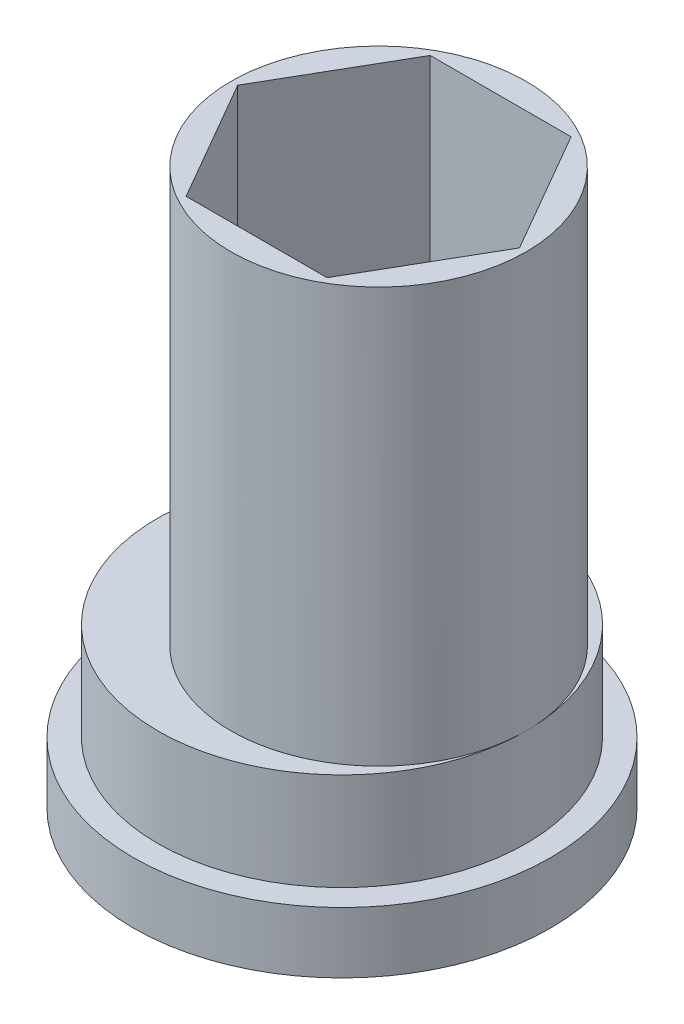
ISO-10303-21;
HEADER;
FILE_DESCRIPTION(('STEP AP214'),'2;1');
FILE_NAME('part.step','',(''),(''),'','','');
FILE_SCHEMA(('AUTOMOTIVE_DESIGN { 1 0 10303 214 1 1 1 1 }'));
ENDSEC;
DATA;
#1=APPLICATION_CONTEXT('core data for automotive mechanical design processes');
#2=APPLICATION_PROTOCOL_DEFINITION('international standard','automotive_design',2000,#1);
#3=PRODUCT_CONTEXT('',#1,'mechanical');
#4=PRODUCT('Part','Part','',(#3));
#5=PRODUCT_RELATED_PRODUCT_CATEGORY('part','',(#4));
#6=PRODUCT_DEFINITION_FORMATION('','',#4);
#7=PRODUCT_DEFINITION_CONTEXT('part definition',#1,'design');
#8=PRODUCT_DEFINITION('design','',#6,#7);
#9=PRODUCT_DEFINITION_SHAPE('','',#8);
#10=(LENGTH_UNIT() NAMED_UNIT(*) SI_UNIT(.MILLI.,.METRE.));
#11=(NAMED_UNIT(*) PLANE_ANGLE_UNIT() SI_UNIT($,.RADIAN.));
#12=(NAMED_UNIT(*) SI_UNIT($,.STERADIAN.) SOLID_ANGLE_UNIT());
#13=UNCERTAINTY_MEASURE_WITH_UNIT(LENGTH_MEASURE(1.E-05),#10,'distance_accuracy_value','');
#14=(GEOMETRIC_REPRESENTATION_CONTEXT(3) GLOBAL_UNCERTAINTY_ASSIGNED_CONTEXT((#13)) GLOBAL_UNIT_ASSIGNED_CONTEXT((#10,
#11,#12)) REPRESENTATION_CONTEXT('',''));
#15=CARTESIAN_POINT('',(0.,0.,0.));
#16=DIRECTION('',(0.,0.,1.));
#17=DIRECTION('',(1.,0.,0.));
#18=AXIS2_PLACEMENT_3D('',#15,#16,#17);
#19=CARTESIAN_POINT('',(4.3301270189222,-4.,2.5));
#20=DIRECTION('',(0.866025403784439,0.,0.5));
#21=DIRECTION('',(0.5,0.,-0.866025403784439));
#22=AXIS2_PLACEMENT_3D('',#19,#20,#21);
#23=PLANE('',#22);
#24=DIRECTION('',(0.,1.,0.));
#25=VECTOR('',#24,1.);
#26=CARTESIAN_POINT('',(2.88675134594813,-4.,5.));
#27=LINE('',#26,#25);
#28=CARTESIAN_POINT('',(2.88675134594813,-6.5,5.));
#29=VERTEX_POINT('',#28);
#30=CARTESIAN_POINT('',(2.88675134594813,17.,5.));
#31=VERTEX_POINT('',#30);
#32=EDGE_CURVE('E63',#29,#31,#27,.T.);
#33=ORIENTED_EDGE('',*,*,#32,.T.);
#34=DIRECTION('',(0.5,0.,-0.866025403784439));
#35=VECTOR('',#34,1.);
#36=CARTESIAN_POINT('',(4.3301270189222,17.,2.5));
#37=LINE('',#36,#35);
#38=CARTESIAN_POINT('',(5.77350269189626,17.,0.));
#39=VERTEX_POINT('',#38);
#40=EDGE_CURVE('E118',#31,#39,#37,.T.);
#41=ORIENTED_EDGE('',*,*,#40,.T.);
#42=DIRECTION('',(0.,1.,0.));
#43=VECTOR('',#42,1.);
#44=CARTESIAN_POINT('',(5.77350269189626,-4.,0.));
#45=LINE('',#44,#43);
#46=CARTESIAN_POINT('',(5.77350269189626,-6.5,0.));
#47=VERTEX_POINT('',#46);
#48=EDGE_CURVE('E12',#47,#39,#45,.T.);
#49=ORIENTED_EDGE('',*,*,#48,.F.);
#50=DIRECTION('',(0.5,0.,-0.866025403784439));
#51=VECTOR('',#50,1.);
#52=CARTESIAN_POINT('',(4.3301270189222,-6.5,2.5));
#53=LINE('',#52,#51);
#54=EDGE_CURVE('E121',#29,#47,#53,.T.);
#55=ORIENTED_EDGE('',*,*,#54,.F.);
#56=EDGE_LOOP('',(#33,#41,#49,#55));
#57=FACE_BOUND('',#56,.T.);
#58=ADVANCED_FACE('F60',(#57),#23,.F.);
#59=CARTESIAN_POINT('',(4.33012701892219,-4.,-2.5));
#60=DIRECTION('',(0.866025403784438,0.,-0.5));
#61=DIRECTION('',(-0.5,0.,-0.866025403784438));
#62=AXIS2_PLACEMENT_3D('',#59,#60,#61);
#63=PLANE('',#62);
#64=ORIENTED_EDGE('',*,*,#48,.T.);
#65=DIRECTION('',(-0.5,0.,-0.866025403784438));
#66=VECTOR('',#65,1.);
#67=CARTESIAN_POINT('',(4.33012701892219,17.,-2.5));
#68=LINE('',#67,#66);
#69=CARTESIAN_POINT('',(2.88675134594813,17.,-5.));
#70=VERTEX_POINT('',#69);
#71=EDGE_CURVE('E136',#39,#70,#68,.T.);
#72=ORIENTED_EDGE('',*,*,#71,.T.);
#73=DIRECTION('',(0.,1.,0.));
#74=VECTOR('',#73,1.);
#75=CARTESIAN_POINT('',(2.88675134594813,-4.,-5.));
#76=LINE('',#75,#74);
#77=CARTESIAN_POINT('',(2.88675134594813,-6.5,-5.));
#78=VERTEX_POINT('',#77);
#79=EDGE_CURVE('E68',#78,#70,#76,.T.);
#80=ORIENTED_EDGE('',*,*,#79,.F.);
#81=DIRECTION('',(-0.5,0.,-0.866025403784438));
#82=VECTOR('',#81,1.);
#83=CARTESIAN_POINT('',(4.3301270189222,-6.5,-2.5));
#84=LINE('',#83,#82);
#85=EDGE_CURVE('E167',#47,#78,#84,.T.);
#86=ORIENTED_EDGE('',*,*,#85,.F.);
#87=EDGE_LOOP('',(#64,#72,#80,#86));
#88=FACE_BOUND('',#87,.T.);
#89=ADVANCED_FACE('F190',(#88),#63,.F.);
#90=CARTESIAN_POINT('',(0.,-4.,-5.));
#91=DIRECTION('',(0.,0.,-1.));
#92=DIRECTION('',(-1.,0.,0.));
#93=AXIS2_PLACEMENT_3D('',#90,#91,#92);
#94=PLANE('',#93);
#95=ORIENTED_EDGE('',*,*,#79,.T.);
#96=DIRECTION('',(-1.,0.,0.));
#97=VECTOR('',#96,1.);
#98=CARTESIAN_POINT('',(0.,17.,-5.));
#99=LINE('',#98,#97);
#100=CARTESIAN_POINT('',(-2.88675134594813,17.,-5.));
#101=VERTEX_POINT('',#100);
#102=EDGE_CURVE('E146',#70,#101,#99,.T.);
#103=ORIENTED_EDGE('',*,*,#102,.T.);
#104=DIRECTION('',(0.,1.,0.));
#105=VECTOR('',#104,1.);
#106=CARTESIAN_POINT('',(-2.88675134594813,-4.,-5.));
#107=LINE('',#106,#105);
#108=CARTESIAN_POINT('',(-2.88675134594813,-6.5,-5.));
#109=VERTEX_POINT('',#108);
#110=EDGE_CURVE('E182',#109,#101,#107,.T.);
#111=ORIENTED_EDGE('',*,*,#110,.F.);
#112=DIRECTION('',(-1.,0.,0.));
#113=VECTOR('',#112,1.);
#114=CARTESIAN_POINT('',(0.,-6.5,-5.));
#115=LINE('',#114,#113);
#116=EDGE_CURVE('E153',#78,#109,#115,.T.);
#117=ORIENTED_EDGE('',*,*,#116,.F.);
#118=EDGE_LOOP('',(#95,#103,#111,#117));
#119=FACE_BOUND('',#118,.T.);
#120=ADVANCED_FACE('F189',(#119),#94,.F.);
#121=CARTESIAN_POINT('',(-4.33012701892219,-4.,-2.5));
#122=DIRECTION('',(-0.866025403784439,0.,-0.5));
#123=DIRECTION('',(-0.5,0.,0.866025403784439));
#124=AXIS2_PLACEMENT_3D('',#121,#122,#123);
#125=PLANE('',#124);
#126=ORIENTED_EDGE('',*,*,#110,.T.);
#127=DIRECTION('',(-0.5,0.,0.866025403784439));
#128=VECTOR('',#127,1.);
#129=CARTESIAN_POINT('',(-4.33012701892219,17.,-2.5));
#130=LINE('',#129,#128);
#131=CARTESIAN_POINT('',(-5.77350269189626,17.,0.));
#132=VERTEX_POINT('',#131);
#133=EDGE_CURVE('E142',#101,#132,#130,.T.);
#134=ORIENTED_EDGE('',*,*,#133,.T.);
#135=DIRECTION('',(0.,1.,0.));
#136=VECTOR('',#135,1.);
#137=CARTESIAN_POINT('',(-5.77350269189626,-4.,0.));
#138=LINE('',#137,#136);
#139=CARTESIAN_POINT('',(-5.77350269189626,-6.5,0.));
#140=VERTEX_POINT('',#139);
#141=EDGE_CURVE('E76',#140,#132,#138,.T.);
#142=ORIENTED_EDGE('',*,*,#141,.F.);
#143=DIRECTION('',(-0.5,0.,0.866025403784439));
#144=VECTOR('',#143,1.);
#145=CARTESIAN_POINT('',(-4.33012701892219,-6.5,-2.5));
#146=LINE('',#145,#144);
#147=EDGE_CURVE('E158',#109,#140,#146,.T.);
#148=ORIENTED_EDGE('',*,*,#147,.F.);
#149=EDGE_LOOP('',(#126,#134,#142,#148));
#150=FACE_BOUND('',#149,.T.);
#151=ADVANCED_FACE('F187',(#150),#125,.F.);
#152=CARTESIAN_POINT('',(-4.33012701892219,-4.,2.5));
#153=DIRECTION('',(-0.866025403784439,0.,0.5));
#154=DIRECTION('',(0.5,0.,0.866025403784439));
#155=AXIS2_PLACEMENT_3D('',#152,#153,#154);
#156=PLANE('',#155);
#157=ORIENTED_EDGE('',*,*,#141,.T.);
#158=DIRECTION('',(0.5,0.,0.866025403784439));
#159=VECTOR('',#158,1.);
#160=CARTESIAN_POINT('',(-4.33012701892219,17.,2.5));
#161=LINE('',#160,#159);
#162=CARTESIAN_POINT('',(-2.88675134594813,17.,5.));
#163=VERTEX_POINT('',#162);
#164=EDGE_CURVE('E140',#132,#163,#161,.T.);
#165=ORIENTED_EDGE('',*,*,#164,.T.);
#166=DIRECTION('',(0.,1.,0.));
#167=VECTOR('',#166,1.);
#168=CARTESIAN_POINT('',(-2.88675134594813,-4.,5.));
#169=LINE('',#168,#167);
#170=CARTESIAN_POINT('',(-2.88675134594813,-6.5,5.));
#171=VERTEX_POINT('',#170);
#172=EDGE_CURVE('E126',#171,#163,#169,.T.);
#173=ORIENTED_EDGE('',*,*,#172,.F.);
#174=DIRECTION('',(0.5,0.,0.866025403784439));
#175=VECTOR('',#174,1.);
#176=CARTESIAN_POINT('',(-4.33012701892219,-6.5,2.5));
#177=LINE('',#176,#175);
#178=EDGE_CURVE('E161',#140,#171,#177,.T.);
#179=ORIENTED_EDGE('',*,*,#178,.F.);
#180=EDGE_LOOP('',(#157,#165,#173,#179));
#181=FACE_BOUND('',#180,.T.);
#182=ADVANCED_FACE('F185',(#181),#156,.F.);
#183=CARTESIAN_POINT('',(0.,-4.,5.));
#184=DIRECTION('',(0.,0.,1.));
#185=DIRECTION('',(1.,0.,0.));
#186=AXIS2_PLACEMENT_3D('',#183,#184,#185);
#187=PLANE('',#186);
#188=ORIENTED_EDGE('',*,*,#172,.T.);
#189=DIRECTION('',(1.,0.,0.));
#190=VECTOR('',#189,1.);
#191=CARTESIAN_POINT('',(0.,17.,5.));
#192=LINE('',#191,#190);
#193=EDGE_CURVE('E133',#163,#31,#192,.T.);
#194=ORIENTED_EDGE('',*,*,#193,.T.);
#195=ORIENTED_EDGE('',*,*,#32,.F.);
#196=DIRECTION('',(1.,0.,0.));
#197=VECTOR('',#196,1.);
#198=CARTESIAN_POINT('',(0.,-6.5,5.));
#199=LINE('',#198,#197);
#200=EDGE_CURVE('E164',#171,#29,#199,.T.);
#201=ORIENTED_EDGE('',*,*,#200,.F.);
#202=EDGE_LOOP('',(#188,#194,#195,#201));
#203=FACE_BOUND('',#202,.T.);
#204=ADVANCED_FACE('F139',(#203),#187,.F.);
#205=CARTESIAN_POINT('',(-1.5,-4.,0.));
#206=DIRECTION('',(0.,1.,0.));
#207=DIRECTION('',(0.,0.,1.));
#208=AXIS2_PLACEMENT_3D('',#205,#206,#207);
#209=CYLINDRICAL_SURFACE('',#208,7.55);
#210=CARTESIAN_POINT('',(-1.5,-4.,0.));
#211=DIRECTION('',(0.,1.,0.));
#212=DIRECTION('',(0.,0.,1.));
#213=AXIS2_PLACEMENT_3D('',#210,#211,#212);
#214=CIRCLE('',#213,7.55);
#215=CARTESIAN_POINT('',(-1.5,-4.,7.55));
#216=VERTEX_POINT('',#215);
#217=EDGE_CURVE('E174',#216,#216,#214,.T.);
#218=ORIENTED_EDGE('',*,*,#217,.T.);
#219=EDGE_LOOP('',(#218));
#220=FACE_BOUND('',#219,.T.);
#221=CARTESIAN_POINT('',(-1.5,0.,0.));
#222=DIRECTION('',(0.,1.,0.));
#223=DIRECTION('',(0.,0.,1.));
#224=AXIS2_PLACEMENT_3D('',#221,#222,#223);
#225=CIRCLE('',#224,7.55);
#226=CARTESIAN_POINT('',(6.05,0.,0.));
#227=VERTEX_POINT('',#226);
#228=EDGE_CURVE('E127',#227,#227,#225,.T.);
#229=ORIENTED_EDGE('',*,*,#228,.F.);
#230=EDGE_LOOP('',(#229));
#231=FACE_BOUND('',#230,.T.);
#232=ADVANCED_FACE('F226',(#220,#231),#209,.T.);
#233=CARTESIAN_POINT('',(0.,0.,0.));
#234=DIRECTION('',(0.,1.,0.));
#235=DIRECTION('',(0.,0.,1.));
#236=AXIS2_PLACEMENT_3D('',#233,#234,#235);
#237=PLANE('',#236);
#238=ORIENTED_EDGE('',*,*,#228,.T.);
#239=CARTESIAN_POINT('',(0.,0.,0.));
#240=DIRECTION('',(0.,1.,0.));
#241=DIRECTION('',(0.,0.,1.));
#242=AXIS2_PLACEMENT_3D('',#239,#240,#241);
#243=CIRCLE('',#242,6.05);
#244=EDGE_CURVE('E137',#227,#227,#243,.T.);
#245=ORIENTED_EDGE('',*,*,#244,.F.);
#246=EDGE_LOOP('',(#238,#245));
#247=FACE_BOUND('',#246,.T.);
#248=ADVANCED_FACE('F202',(#247),#237,.T.);
#249=CARTESIAN_POINT('',(-1.5,-6.5,0.));
#250=DIRECTION('',(0.,1.,0.));
#251=DIRECTION('',(0.,0.,1.));
#252=AXIS2_PLACEMENT_3D('',#249,#250,#251);
#253=CYLINDRICAL_SURFACE('',#252,8.55);
#254=CARTESIAN_POINT('',(-1.5,-6.5,0.));
#255=DIRECTION('',(0.,1.,0.));
#256=DIRECTION('',(0.,0.,1.));
#257=AXIS2_PLACEMENT_3D('',#254,#255,#256);
#258=CIRCLE('',#257,8.55);
#259=CARTESIAN_POINT('',(-1.5,-6.5,8.55));
#260=VERTEX_POINT('',#259);
#261=EDGE_CURVE('E171',#260,#260,#258,.T.);
#262=ORIENTED_EDGE('',*,*,#261,.T.);
#263=EDGE_LOOP('',(#262));
#264=FACE_BOUND('',#263,.T.);
#265=CARTESIAN_POINT('',(-1.5,-4.,0.));
#266=DIRECTION('',(0.,1.,0.));
#267=DIRECTION('',(0.,0.,1.));
#268=AXIS2_PLACEMENT_3D('',#265,#266,#267);
#269=CIRCLE('',#268,8.55);
#270=CARTESIAN_POINT('',(-1.5,-4.,8.55));
#271=VERTEX_POINT('',#270);
#272=EDGE_CURVE('E170',#271,#271,#269,.T.);
#273=ORIENTED_EDGE('',*,*,#272,.F.);
#274=EDGE_LOOP('',(#273));
#275=FACE_BOUND('',#274,.T.);
#276=ADVANCED_FACE('F196',(#264,#275),#253,.T.);
#277=CARTESIAN_POINT('',(-1.5,-6.5,0.));
#278=DIRECTION('',(0.,1.,0.));
#279=DIRECTION('',(0.,0.,1.));
#280=AXIS2_PLACEMENT_3D('',#277,#278,#279);
#281=PLANE('',#280);
#282=ORIENTED_EDGE('',*,*,#85,.T.);
#283=ORIENTED_EDGE('',*,*,#116,.T.);
#284=ORIENTED_EDGE('',*,*,#147,.T.);
#285=ORIENTED_EDGE('',*,*,#178,.T.);
#286=ORIENTED_EDGE('',*,*,#200,.T.);
#287=ORIENTED_EDGE('',*,*,#54,.T.);
#288=EDGE_LOOP('',(#282,#283,#284,#285,#286,#287));
#289=FACE_BOUND('',#288,.T.);
#290=ORIENTED_EDGE('',*,*,#261,.F.);
#291=EDGE_LOOP('',(#290));
#292=FACE_BOUND('',#291,.T.);
#293=ADVANCED_FACE('F192',(#289,#292),#281,.F.);
#294=CARTESIAN_POINT('',(-1.5,-4.,0.));
#295=DIRECTION('',(0.,1.,0.));
#296=DIRECTION('',(0.,0.,1.));
#297=AXIS2_PLACEMENT_3D('',#294,#295,#296);
#298=PLANE('',#297);
#299=ORIENTED_EDGE('',*,*,#217,.F.);
#300=EDGE_LOOP('',(#299));
#301=FACE_BOUND('',#300,.T.);
#302=ORIENTED_EDGE('',*,*,#272,.T.);
#303=EDGE_LOOP('',(#302));
#304=FACE_BOUND('',#303,.T.);
#305=ADVANCED_FACE('F195',(#301,#304),#298,.T.);
#306=CARTESIAN_POINT('',(0.,17.,0.));
#307=DIRECTION('',(0.,-1.,0.));
#308=DIRECTION('',(0.,0.,-1.));
#309=AXIS2_PLACEMENT_3D('',#306,#307,#308);
#310=CYLINDRICAL_SURFACE('',#309,6.05);
#311=CARTESIAN_POINT('',(0.,17.,0.));
#312=DIRECTION('',(0.,1.,0.));
#313=DIRECTION('',(0.,0.,1.));
#314=AXIS2_PLACEMENT_3D('',#311,#312,#313);
#315=CIRCLE('',#314,6.05);
#316=CARTESIAN_POINT('',(0.,17.,6.05));
#317=VERTEX_POINT('',#316);
#318=EDGE_CURVE('E150',#317,#317,#315,.T.);
#319=ORIENTED_EDGE('',*,*,#318,.F.);
#320=EDGE_LOOP('',(#319));
#321=FACE_BOUND('',#320,.T.);
#322=ORIENTED_EDGE('',*,*,#244,.T.);
#323=EDGE_LOOP('',(#322));
#324=FACE_BOUND('',#323,.T.);
#325=ADVANCED_FACE('F207',(#321,#324),#310,.T.);
#326=CARTESIAN_POINT('',(0.,17.,0.));
#327=DIRECTION('',(0.,1.,0.));
#328=DIRECTION('',(0.,0.,1.));
#329=AXIS2_PLACEMENT_3D('',#326,#327,#328);
#330=PLANE('',#329);
#331=ORIENTED_EDGE('',*,*,#40,.F.);
#332=ORIENTED_EDGE('',*,*,#193,.F.);
#333=ORIENTED_EDGE('',*,*,#164,.F.);
#334=ORIENTED_EDGE('',*,*,#133,.F.);
#335=ORIENTED_EDGE('',*,*,#102,.F.);
#336=ORIENTED_EDGE('',*,*,#71,.F.);
#337=EDGE_LOOP('',(#331,#332,#333,#334,#335,#336));
#338=FACE_BOUND('',#337,.T.);
#339=ORIENTED_EDGE('',*,*,#318,.T.);
#340=EDGE_LOOP('',(#339));
#341=FACE_BOUND('',#340,.T.);
#342=ADVANCED_FACE('F130',(#338,#341),#330,.T.);
#343=CLOSED_SHELL('',(#58,#89,#120,#151,#182,#204,#232,#248,#276,#293,#305,#325,#342));
#344=MANIFOLD_SOLID_BREP('B2',#343);
#345=ADVANCED_BREP_SHAPE_REPRESENTATION('',(#18,#344),#14);
#346=SHAPE_DEFINITION_REPRESENTATION(#9,#345);
ENDSEC;
END-ISO-10303-21;
